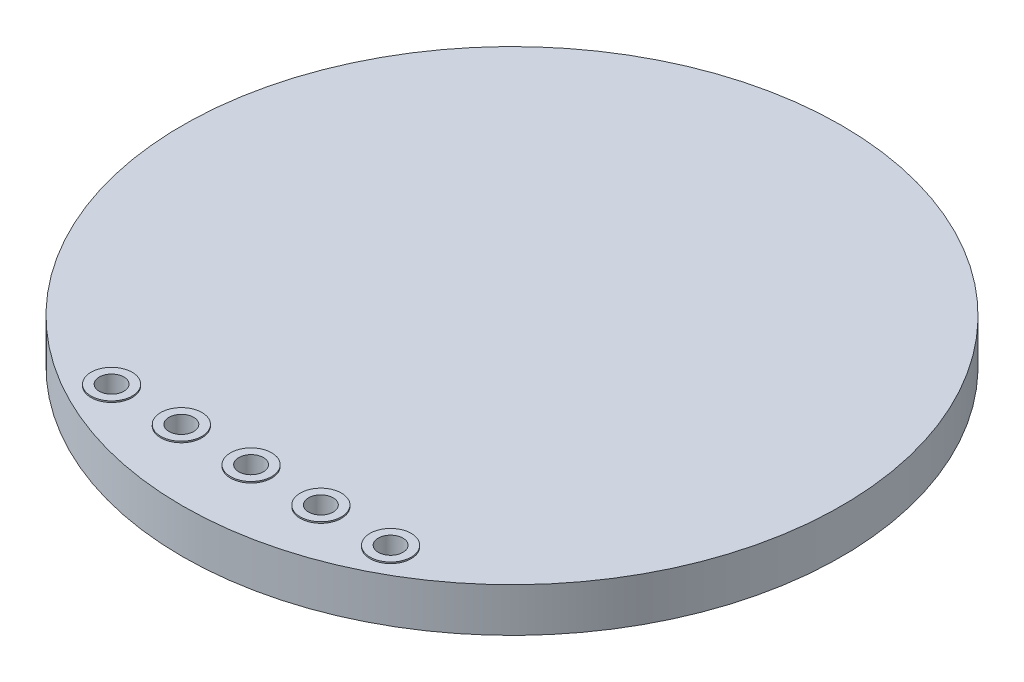
ISO-10303-21;
HEADER;
FILE_DESCRIPTION(('STEP AP214'),'2;1');
FILE_NAME('part.step','',(''),(''),'','','');
FILE_SCHEMA(('AUTOMOTIVE_DESIGN { 1 0 10303 214 1 1 1 1 }'));
ENDSEC;
DATA;
#1=APPLICATION_CONTEXT('core data for automotive mechanical design processes');
#2=APPLICATION_PROTOCOL_DEFINITION('international standard','automotive_design',2000,#1);
#3=PRODUCT_CONTEXT('',#1,'mechanical');
#4=PRODUCT('Part','Part','',(#3));
#5=PRODUCT_RELATED_PRODUCT_CATEGORY('part','',(#4));
#6=PRODUCT_DEFINITION_FORMATION('','',#4);
#7=PRODUCT_DEFINITION_CONTEXT('part definition',#1,'design');
#8=PRODUCT_DEFINITION('design','',#6,#7);
#9=PRODUCT_DEFINITION_SHAPE('','',#8);
#10=(LENGTH_UNIT() NAMED_UNIT(*) SI_UNIT(.MILLI.,.METRE.));
#11=(NAMED_UNIT(*) PLANE_ANGLE_UNIT() SI_UNIT($,.RADIAN.));
#12=(NAMED_UNIT(*) SI_UNIT($,.STERADIAN.) SOLID_ANGLE_UNIT());
#13=UNCERTAINTY_MEASURE_WITH_UNIT(LENGTH_MEASURE(1.E-05),#10,'distance_accuracy_value','');
#14=(GEOMETRIC_REPRESENTATION_CONTEXT(3) GLOBAL_UNCERTAINTY_ASSIGNED_CONTEXT((#13)) GLOBAL_UNIT_ASSIGNED_CONTEXT((#10,
#11,#12)) REPRESENTATION_CONTEXT('',''));
#15=CARTESIAN_POINT('',(0.,0.,0.));
#16=DIRECTION('',(0.,0.,1.));
#17=DIRECTION('',(1.,0.,0.));
#18=AXIS2_PLACEMENT_3D('',#15,#16,#17);
#19=CARTESIAN_POINT('',(0.,0.8,0.));
#20=DIRECTION('',(0.,1.,0.));
#21=DIRECTION('',(0.,0.,1.));
#22=AXIS2_PLACEMENT_3D('',#19,#20,#21);
#23=PLANE('',#22);
#24=CARTESIAN_POINT('',(2.54,0.8,9.5));
#25=DIRECTION('',(0.,1.,0.));
#26=DIRECTION('',(0.,0.,1.));
#27=AXIS2_PLACEMENT_3D('',#24,#25,#26);
#28=CIRCLE('',#27,0.750000000000001);
#29=CARTESIAN_POINT('',(2.54,0.8,10.25));
#30=VERTEX_POINT('',#29);
#31=EDGE_CURVE('E79',#30,#30,#28,.F.);
#32=ORIENTED_EDGE('',*,*,#31,.T.);
#33=EDGE_LOOP('',(#32));
#34=FACE_BOUND('',#33,.T.);
#35=CARTESIAN_POINT('',(-2.54,0.8,9.50000000000002));
#36=DIRECTION('',(0.,1.,0.));
#37=DIRECTION('',(0.,0.,1.));
#38=AXIS2_PLACEMENT_3D('',#35,#36,#37);
#39=CIRCLE('',#38,0.750000000000001);
#40=CARTESIAN_POINT('',(-2.54,0.8,10.25));
#41=VERTEX_POINT('',#40);
#42=EDGE_CURVE('E67',#41,#41,#39,.F.);
#43=ORIENTED_EDGE('',*,*,#42,.T.);
#44=EDGE_LOOP('',(#43));
#45=FACE_BOUND('',#44,.T.);
#46=CARTESIAN_POINT('',(0.,0.8,0.));
#47=DIRECTION('',(0.,1.,0.));
#48=DIRECTION('',(0.,0.,1.));
#49=AXIS2_PLACEMENT_3D('',#46,#47,#48);
#50=CIRCLE('',#49,12.);
#51=CARTESIAN_POINT('',(0.,0.8,12.));
#52=VERTEX_POINT('',#51);
#53=EDGE_CURVE('E10',#52,#52,#50,.T.);
#54=ORIENTED_EDGE('',*,*,#53,.T.);
#55=EDGE_LOOP('',(#54));
#56=FACE_BOUND('',#55,.T.);
#57=CARTESIAN_POINT('',(-5.08,0.8,9.50000000000003));
#58=DIRECTION('',(0.,1.,0.));
#59=DIRECTION('',(0.,0.,1.));
#60=AXIS2_PLACEMENT_3D('',#57,#58,#59);
#61=CIRCLE('',#60,0.750000000000003);
#62=CARTESIAN_POINT('',(-5.08,0.8,10.25));
#63=VERTEX_POINT('',#62);
#64=EDGE_CURVE('E58',#63,#63,#61,.F.);
#65=ORIENTED_EDGE('',*,*,#64,.T.);
#66=EDGE_LOOP('',(#65));
#67=FACE_BOUND('',#66,.T.);
#68=CARTESIAN_POINT('',(0.,0.8,9.5));
#69=DIRECTION('',(0.,1.,0.));
#70=DIRECTION('',(0.,0.,1.));
#71=AXIS2_PLACEMENT_3D('',#68,#69,#70);
#72=CIRCLE('',#71,0.750000000000001);
#73=CARTESIAN_POINT('',(0.,0.8,10.25));
#74=VERTEX_POINT('',#73);
#75=EDGE_CURVE('E73',#74,#74,#72,.F.);
#76=ORIENTED_EDGE('',*,*,#75,.T.);
#77=EDGE_LOOP('',(#76));
#78=FACE_BOUND('',#77,.T.);
#79=CARTESIAN_POINT('',(5.08,0.8,9.5));
#80=DIRECTION('',(0.,1.,0.));
#81=DIRECTION('',(0.,0.,1.));
#82=AXIS2_PLACEMENT_3D('',#79,#80,#81);
#83=CIRCLE('',#82,0.750000000000003);
#84=CARTESIAN_POINT('',(5.08,0.8,10.25));
#85=VERTEX_POINT('',#84);
#86=EDGE_CURVE('E85',#85,#85,#83,.F.);
#87=ORIENTED_EDGE('',*,*,#86,.T.);
#88=EDGE_LOOP('',(#87));
#89=FACE_BOUND('',#88,.T.);
#90=ADVANCED_FACE('F43',(#34,#45,#56,#67,#78,#89),#23,.T.);
#91=CARTESIAN_POINT('',(0.,0.8,0.));
#92=DIRECTION('',(0.,-1.,0.));
#93=DIRECTION('',(0.,0.,-1.));
#94=AXIS2_PLACEMENT_3D('',#91,#92,#93);
#95=CYLINDRICAL_SURFACE('',#94,12.);
#96=ORIENTED_EDGE('',*,*,#53,.F.);
#97=EDGE_LOOP('',(#96));
#98=FACE_BOUND('',#97,.T.);
#99=CARTESIAN_POINT('',(0.,-0.8,0.));
#100=DIRECTION('',(0.,1.,0.));
#101=DIRECTION('',(0.,0.,1.));
#102=AXIS2_PLACEMENT_3D('',#99,#100,#101);
#103=CIRCLE('',#102,12.);
#104=CARTESIAN_POINT('',(0.,-0.8,12.));
#105=VERTEX_POINT('',#104);
#106=EDGE_CURVE('E52',#105,#105,#103,.T.);
#107=ORIENTED_EDGE('',*,*,#106,.T.);
#108=EDGE_LOOP('',(#107));
#109=FACE_BOUND('',#108,.T.);
#110=ADVANCED_FACE('F45',(#98,#109),#95,.T.);
#111=CARTESIAN_POINT('',(0.,-0.8,0.));
#112=DIRECTION('',(0.,1.,0.));
#113=DIRECTION('',(0.,0.,1.));
#114=AXIS2_PLACEMENT_3D('',#111,#112,#113);
#115=PLANE('',#114);
#116=CARTESIAN_POINT('',(5.08,-0.8,9.5));
#117=DIRECTION('',(0.,1.,0.));
#118=DIRECTION('',(0.,0.,1.));
#119=AXIS2_PLACEMENT_3D('',#116,#117,#118);
#120=CIRCLE('',#119,0.750000000000003);
#121=CARTESIAN_POINT('',(5.08,-0.8,10.25));
#122=VERTEX_POINT('',#121);
#123=EDGE_CURVE('E47',#122,#122,#120,.T.);
#124=ORIENTED_EDGE('',*,*,#123,.T.);
#125=EDGE_LOOP('',(#124));
#126=FACE_BOUND('',#125,.T.);
#127=CARTESIAN_POINT('',(2.54,-0.8,9.5));
#128=DIRECTION('',(0.,1.,0.));
#129=DIRECTION('',(0.,0.,1.));
#130=AXIS2_PLACEMENT_3D('',#127,#128,#129);
#131=CIRCLE('',#130,0.750000000000001);
#132=CARTESIAN_POINT('',(2.54,-0.8,10.25));
#133=VERTEX_POINT('',#132);
#134=EDGE_CURVE('E108',#133,#133,#131,.T.);
#135=ORIENTED_EDGE('',*,*,#134,.T.);
#136=EDGE_LOOP('',(#135));
#137=FACE_BOUND('',#136,.T.);
#138=CARTESIAN_POINT('',(0.,-0.8,9.5));
#139=DIRECTION('',(0.,1.,0.));
#140=DIRECTION('',(0.,0.,1.));
#141=AXIS2_PLACEMENT_3D('',#138,#139,#140);
#142=CIRCLE('',#141,0.750000000000001);
#143=CARTESIAN_POINT('',(0.,-0.8,10.25));
#144=VERTEX_POINT('',#143);
#145=EDGE_CURVE('E103',#144,#144,#142,.T.);
#146=ORIENTED_EDGE('',*,*,#145,.T.);
#147=EDGE_LOOP('',(#146));
#148=FACE_BOUND('',#147,.T.);
#149=CARTESIAN_POINT('',(-2.54,-0.8,9.50000000000002));
#150=DIRECTION('',(0.,1.,0.));
#151=DIRECTION('',(0.,0.,1.));
#152=AXIS2_PLACEMENT_3D('',#149,#150,#151);
#153=CIRCLE('',#152,0.750000000000001);
#154=CARTESIAN_POINT('',(-2.54,-0.8,10.25));
#155=VERTEX_POINT('',#154);
#156=EDGE_CURVE('E97',#155,#155,#153,.T.);
#157=ORIENTED_EDGE('',*,*,#156,.T.);
#158=EDGE_LOOP('',(#157));
#159=FACE_BOUND('',#158,.T.);
#160=CARTESIAN_POINT('',(-5.08,-0.8,9.50000000000003));
#161=DIRECTION('',(0.,1.,0.));
#162=DIRECTION('',(0.,0.,1.));
#163=AXIS2_PLACEMENT_3D('',#160,#161,#162);
#164=CIRCLE('',#163,0.750000000000003);
#165=CARTESIAN_POINT('',(-5.08,-0.8,10.25));
#166=VERTEX_POINT('',#165);
#167=EDGE_CURVE('E91',#166,#166,#164,.T.);
#168=ORIENTED_EDGE('',*,*,#167,.T.);
#169=EDGE_LOOP('',(#168));
#170=FACE_BOUND('',#169,.T.);
#171=ORIENTED_EDGE('',*,*,#106,.F.);
#172=EDGE_LOOP('',(#171));
#173=FACE_BOUND('',#172,.T.);
#174=ADVANCED_FACE('F200',(#126,#137,#148,#159,#170,#173),#115,.F.);
#175=CARTESIAN_POINT('',(0.,-0.8,9.5));
#176=DIRECTION('',(0.,1.,0.));
#177=DIRECTION('',(0.,0.,1.));
#178=AXIS2_PLACEMENT_3D('',#175,#176,#177);
#179=CYLINDRICAL_SURFACE('',#178,0.450000000000001);
#180=CARTESIAN_POINT('',(0.,0.85,9.5));
#181=DIRECTION('',(0.,1.,0.));
#182=DIRECTION('',(0.,0.,1.));
#183=AXIS2_PLACEMENT_3D('',#180,#181,#182);
#184=CIRCLE('',#183,0.450000000000001);
#185=CARTESIAN_POINT('',(0.,0.85,9.95));
#186=VERTEX_POINT('',#185);
#187=EDGE_CURVE('E78',#186,#186,#184,.T.);
#188=ORIENTED_EDGE('',*,*,#187,.T.);
#189=EDGE_LOOP('',(#188));
#190=FACE_BOUND('',#189,.T.);
#191=CARTESIAN_POINT('',(0.,-0.85,9.5));
#192=DIRECTION('',(0.,1.,0.));
#193=DIRECTION('',(0.,0.,1.));
#194=AXIS2_PLACEMENT_3D('',#191,#192,#193);
#195=CIRCLE('',#194,0.450000000000001);
#196=CARTESIAN_POINT('',(0.,-0.85,9.95));
#197=VERTEX_POINT('',#196);
#198=EDGE_CURVE('E111',#197,#197,#195,.T.);
#199=ORIENTED_EDGE('',*,*,#198,.F.);
#200=EDGE_LOOP('',(#199));
#201=FACE_BOUND('',#200,.T.);
#202=ADVANCED_FACE('F204',(#190,#201),#179,.F.);
#203=CARTESIAN_POINT('',(2.54,-0.8,9.5));
#204=DIRECTION('',(0.,1.,0.));
#205=DIRECTION('',(0.,0.,1.));
#206=AXIS2_PLACEMENT_3D('',#203,#204,#205);
#207=CYLINDRICAL_SURFACE('',#206,0.45);
#208=CARTESIAN_POINT('',(2.54,0.85,9.5));
#209=DIRECTION('',(0.,1.,0.));
#210=DIRECTION('',(0.,0.,1.));
#211=AXIS2_PLACEMENT_3D('',#208,#209,#210);
#212=CIRCLE('',#211,0.450000000000001);
#213=CARTESIAN_POINT('',(2.54,0.85,9.95));
#214=VERTEX_POINT('',#213);
#215=EDGE_CURVE('E84',#214,#214,#212,.T.);
#216=ORIENTED_EDGE('',*,*,#215,.T.);
#217=EDGE_LOOP('',(#216));
#218=FACE_BOUND('',#217,.T.);
#219=CARTESIAN_POINT('',(2.54,-0.85,9.5));
#220=DIRECTION('',(0.,1.,0.));
#221=DIRECTION('',(0.,0.,1.));
#222=AXIS2_PLACEMENT_3D('',#219,#220,#221);
#223=CIRCLE('',#222,0.450000000000001);
#224=CARTESIAN_POINT('',(2.54,-0.85,9.95));
#225=VERTEX_POINT('',#224);
#226=EDGE_CURVE('E120',#225,#225,#223,.T.);
#227=ORIENTED_EDGE('',*,*,#226,.F.);
#228=EDGE_LOOP('',(#227));
#229=FACE_BOUND('',#228,.T.);
#230=ADVANCED_FACE('F211',(#218,#229),#207,.F.);
#231=CARTESIAN_POINT('',(5.08,-0.8,9.5));
#232=DIRECTION('',(0.,1.,0.));
#233=DIRECTION('',(0.,0.,1.));
#234=AXIS2_PLACEMENT_3D('',#231,#232,#233);
#235=CYLINDRICAL_SURFACE('',#234,0.450000000000002);
#236=CARTESIAN_POINT('',(5.08,0.85,9.5));
#237=DIRECTION('',(0.,1.,0.));
#238=DIRECTION('',(0.,0.,1.));
#239=AXIS2_PLACEMENT_3D('',#236,#237,#238);
#240=CIRCLE('',#239,0.450000000000003);
#241=CARTESIAN_POINT('',(5.08,0.85,9.95));
#242=VERTEX_POINT('',#241);
#243=EDGE_CURVE('E90',#242,#242,#240,.T.);
#244=ORIENTED_EDGE('',*,*,#243,.T.);
#245=EDGE_LOOP('',(#244));
#246=FACE_BOUND('',#245,.T.);
#247=CARTESIAN_POINT('',(5.08,-0.85,9.5));
#248=DIRECTION('',(0.,1.,0.));
#249=DIRECTION('',(0.,0.,1.));
#250=AXIS2_PLACEMENT_3D('',#247,#248,#249);
#251=CIRCLE('',#250,0.450000000000003);
#252=CARTESIAN_POINT('',(5.08,-0.85,9.95));
#253=VERTEX_POINT('',#252);
#254=EDGE_CURVE('E317',#253,#253,#251,.T.);
#255=ORIENTED_EDGE('',*,*,#254,.F.);
#256=EDGE_LOOP('',(#255));
#257=FACE_BOUND('',#256,.T.);
#258=ADVANCED_FACE('F275',(#246,#257),#235,.F.);
#259=CARTESIAN_POINT('',(-2.54,-0.8,9.50000000000002));
#260=DIRECTION('',(0.,1.,0.));
#261=DIRECTION('',(0.,0.,1.));
#262=AXIS2_PLACEMENT_3D('',#259,#260,#261);
#263=CYLINDRICAL_SURFACE('',#262,0.45);
#264=CARTESIAN_POINT('',(-2.54,0.85,9.50000000000002));
#265=DIRECTION('',(0.,1.,0.));
#266=DIRECTION('',(0.,0.,1.));
#267=AXIS2_PLACEMENT_3D('',#264,#265,#266);
#268=CIRCLE('',#267,0.450000000000001);
#269=CARTESIAN_POINT('',(-2.54,0.85,9.95000000000002));
#270=VERTEX_POINT('',#269);
#271=EDGE_CURVE('E72',#270,#270,#268,.T.);
#272=ORIENTED_EDGE('',*,*,#271,.T.);
#273=EDGE_LOOP('',(#272));
#274=FACE_BOUND('',#273,.T.);
#275=CARTESIAN_POINT('',(-2.54,-0.85,9.50000000000002));
#276=DIRECTION('',(0.,1.,0.));
#277=DIRECTION('',(0.,0.,1.));
#278=AXIS2_PLACEMENT_3D('',#275,#276,#277);
#279=CIRCLE('',#278,0.450000000000001);
#280=CARTESIAN_POINT('',(-2.54,-0.85,9.95000000000002));
#281=VERTEX_POINT('',#280);
#282=EDGE_CURVE('E106',#281,#281,#279,.T.);
#283=ORIENTED_EDGE('',*,*,#282,.F.);
#284=EDGE_LOOP('',(#283));
#285=FACE_BOUND('',#284,.T.);
#286=ADVANCED_FACE('F272',(#274,#285),#263,.F.);
#287=CARTESIAN_POINT('',(-5.08,-0.8,9.50000000000003));
#288=DIRECTION('',(0.,1.,0.));
#289=DIRECTION('',(0.,0.,1.));
#290=AXIS2_PLACEMENT_3D('',#287,#288,#289);
#291=CYLINDRICAL_SURFACE('',#290,0.450000000000002);
#292=CARTESIAN_POINT('',(-5.08,0.85,9.50000000000003));
#293=DIRECTION('',(0.,1.,0.));
#294=DIRECTION('',(0.,0.,1.));
#295=AXIS2_PLACEMENT_3D('',#292,#293,#294);
#296=CIRCLE('',#295,0.450000000000003);
#297=CARTESIAN_POINT('',(-5.08,0.85,9.95000000000004));
#298=VERTEX_POINT('',#297);
#299=EDGE_CURVE('E71',#298,#298,#296,.T.);
#300=ORIENTED_EDGE('',*,*,#299,.T.);
#301=EDGE_LOOP('',(#300));
#302=FACE_BOUND('',#301,.T.);
#303=CARTESIAN_POINT('',(-5.08,-0.85,9.50000000000003));
#304=DIRECTION('',(0.,1.,0.));
#305=DIRECTION('',(0.,0.,1.));
#306=AXIS2_PLACEMENT_3D('',#303,#304,#305);
#307=CIRCLE('',#306,0.450000000000003);
#308=CARTESIAN_POINT('',(-5.08,-0.85,9.95000000000004));
#309=VERTEX_POINT('',#308);
#310=EDGE_CURVE('E101',#309,#309,#307,.T.);
#311=ORIENTED_EDGE('',*,*,#310,.F.);
#312=EDGE_LOOP('',(#311));
#313=FACE_BOUND('',#312,.T.);
#314=ADVANCED_FACE('F190',(#302,#313),#291,.F.);
#315=CARTESIAN_POINT('',(-5.08,0.85,9.50000000000003));
#316=DIRECTION('',(0.,1.,0.));
#317=DIRECTION('',(0.,0.,1.));
#318=AXIS2_PLACEMENT_3D('',#315,#316,#317);
#319=PLANE('',#318);
#320=CARTESIAN_POINT('',(-5.08,0.85,9.50000000000003));
#321=DIRECTION('',(0.,1.,0.));
#322=DIRECTION('',(0.,0.,1.));
#323=AXIS2_PLACEMENT_3D('',#320,#321,#322);
#324=CIRCLE('',#323,0.750000000000003);
#325=CARTESIAN_POINT('',(-5.08,0.85,10.25));
#326=VERTEX_POINT('',#325);
#327=EDGE_CURVE('E61',#326,#326,#324,.T.);
#328=ORIENTED_EDGE('',*,*,#327,.T.);
#329=EDGE_LOOP('',(#328));
#330=FACE_BOUND('',#329,.T.);
#331=ORIENTED_EDGE('',*,*,#299,.F.);
#332=EDGE_LOOP('',(#331));
#333=FACE_BOUND('',#332,.T.);
#334=ADVANCED_FACE('F175',(#330,#333),#319,.T.);
#335=CARTESIAN_POINT('',(-5.08,0.85,9.50000000000003));
#336=DIRECTION('',(0.,-1.,0.));
#337=DIRECTION('',(0.,0.,-1.));
#338=AXIS2_PLACEMENT_3D('',#335,#336,#337);
#339=CYLINDRICAL_SURFACE('',#338,0.750000000000003);
#340=ORIENTED_EDGE('',*,*,#64,.F.);
#341=EDGE_LOOP('',(#340));
#342=FACE_BOUND('',#341,.T.);
#343=ORIENTED_EDGE('',*,*,#327,.F.);
#344=EDGE_LOOP('',(#343));
#345=FACE_BOUND('',#344,.T.);
#346=ADVANCED_FACE('F178',(#342,#345),#339,.T.);
#347=CARTESIAN_POINT('',(-2.54,0.85,9.50000000000002));
#348=DIRECTION('',(0.,1.,0.));
#349=DIRECTION('',(0.,0.,1.));
#350=AXIS2_PLACEMENT_3D('',#347,#348,#349);
#351=PLANE('',#350);
#352=CARTESIAN_POINT('',(-2.54,0.85,9.50000000000002));
#353=DIRECTION('',(0.,1.,0.));
#354=DIRECTION('',(0.,0.,1.));
#355=AXIS2_PLACEMENT_3D('',#352,#353,#354);
#356=CIRCLE('',#355,0.750000000000001);
#357=CARTESIAN_POINT('',(-2.54,0.85,10.25));
#358=VERTEX_POINT('',#357);
#359=EDGE_CURVE('E77',#358,#358,#356,.T.);
#360=ORIENTED_EDGE('',*,*,#359,.T.);
#361=EDGE_LOOP('',(#360));
#362=FACE_BOUND('',#361,.T.);
#363=ORIENTED_EDGE('',*,*,#271,.F.);
#364=EDGE_LOOP('',(#363));
#365=FACE_BOUND('',#364,.T.);
#366=ADVANCED_FACE('F180',(#362,#365),#351,.T.);
#367=CARTESIAN_POINT('',(-2.54,0.85,9.50000000000002));
#368=DIRECTION('',(0.,-1.,0.));
#369=DIRECTION('',(0.,0.,-1.));
#370=AXIS2_PLACEMENT_3D('',#367,#368,#369);
#371=CYLINDRICAL_SURFACE('',#370,0.750000000000001);
#372=ORIENTED_EDGE('',*,*,#42,.F.);
#373=EDGE_LOOP('',(#372));
#374=FACE_BOUND('',#373,.T.);
#375=ORIENTED_EDGE('',*,*,#359,.F.);
#376=EDGE_LOOP('',(#375));
#377=FACE_BOUND('',#376,.T.);
#378=ADVANCED_FACE('F187',(#374,#377),#371,.T.);
#379=CARTESIAN_POINT('',(0.,0.85,9.5));
#380=DIRECTION('',(0.,1.,0.));
#381=DIRECTION('',(0.,0.,1.));
#382=AXIS2_PLACEMENT_3D('',#379,#380,#381);
#383=PLANE('',#382);
#384=CARTESIAN_POINT('',(0.,0.85,9.5));
#385=DIRECTION('',(0.,1.,0.));
#386=DIRECTION('',(0.,0.,1.));
#387=AXIS2_PLACEMENT_3D('',#384,#385,#386);
#388=CIRCLE('',#387,0.750000000000001);
#389=CARTESIAN_POINT('',(0.,0.85,10.25));
#390=VERTEX_POINT('',#389);
#391=EDGE_CURVE('E83',#390,#390,#388,.T.);
#392=ORIENTED_EDGE('',*,*,#391,.T.);
#393=EDGE_LOOP('',(#392));
#394=FACE_BOUND('',#393,.T.);
#395=ORIENTED_EDGE('',*,*,#187,.F.);
#396=EDGE_LOOP('',(#395));
#397=FACE_BOUND('',#396,.T.);
#398=ADVANCED_FACE('F257',(#394,#397),#383,.T.);
#399=CARTESIAN_POINT('',(0.,0.85,9.5));
#400=DIRECTION('',(0.,-1.,0.));
#401=DIRECTION('',(0.,0.,-1.));
#402=AXIS2_PLACEMENT_3D('',#399,#400,#401);
#403=CYLINDRICAL_SURFACE('',#402,0.750000000000001);
#404=ORIENTED_EDGE('',*,*,#75,.F.);
#405=EDGE_LOOP('',(#404));
#406=FACE_BOUND('',#405,.T.);
#407=ORIENTED_EDGE('',*,*,#391,.F.);
#408=EDGE_LOOP('',(#407));
#409=FACE_BOUND('',#408,.T.);
#410=ADVANCED_FACE('F253',(#406,#409),#403,.T.);
#411=CARTESIAN_POINT('',(2.54,0.85,9.5));
#412=DIRECTION('',(0.,1.,0.));
#413=DIRECTION('',(0.,0.,1.));
#414=AXIS2_PLACEMENT_3D('',#411,#412,#413);
#415=PLANE('',#414);
#416=CARTESIAN_POINT('',(2.54,0.85,9.5));
#417=DIRECTION('',(0.,1.,0.));
#418=DIRECTION('',(0.,0.,1.));
#419=AXIS2_PLACEMENT_3D('',#416,#417,#418);
#420=CIRCLE('',#419,0.750000000000001);
#421=CARTESIAN_POINT('',(2.54,0.85,10.25));
#422=VERTEX_POINT('',#421);
#423=EDGE_CURVE('E89',#422,#422,#420,.T.);
#424=ORIENTED_EDGE('',*,*,#423,.T.);
#425=EDGE_LOOP('',(#424));
#426=FACE_BOUND('',#425,.T.);
#427=ORIENTED_EDGE('',*,*,#215,.F.);
#428=EDGE_LOOP('',(#427));
#429=FACE_BOUND('',#428,.T.);
#430=ADVANCED_FACE('F249',(#426,#429),#415,.T.);
#431=CARTESIAN_POINT('',(2.54,0.85,9.5));
#432=DIRECTION('',(0.,-1.,0.));
#433=DIRECTION('',(0.,0.,-1.));
#434=AXIS2_PLACEMENT_3D('',#431,#432,#433);
#435=CYLINDRICAL_SURFACE('',#434,0.750000000000001);
#436=ORIENTED_EDGE('',*,*,#31,.F.);
#437=EDGE_LOOP('',(#436));
#438=FACE_BOUND('',#437,.T.);
#439=ORIENTED_EDGE('',*,*,#423,.F.);
#440=EDGE_LOOP('',(#439));
#441=FACE_BOUND('',#440,.T.);
#442=ADVANCED_FACE('F245',(#438,#441),#435,.T.);
#443=CARTESIAN_POINT('',(5.08,0.85,9.5));
#444=DIRECTION('',(0.,1.,0.));
#445=DIRECTION('',(0.,0.,1.));
#446=AXIS2_PLACEMENT_3D('',#443,#444,#445);
#447=PLANE('',#446);
#448=CARTESIAN_POINT('',(5.08,0.85,9.5));
#449=DIRECTION('',(0.,1.,0.));
#450=DIRECTION('',(0.,0.,1.));
#451=AXIS2_PLACEMENT_3D('',#448,#449,#450);
#452=CIRCLE('',#451,0.750000000000003);
#453=CARTESIAN_POINT('',(5.08,0.85,10.25));
#454=VERTEX_POINT('',#453);
#455=EDGE_CURVE('E95',#454,#454,#452,.T.);
#456=ORIENTED_EDGE('',*,*,#455,.T.);
#457=EDGE_LOOP('',(#456));
#458=FACE_BOUND('',#457,.T.);
#459=ORIENTED_EDGE('',*,*,#243,.F.);
#460=EDGE_LOOP('',(#459));
#461=FACE_BOUND('',#460,.T.);
#462=ADVANCED_FACE('F238',(#458,#461),#447,.T.);
#463=CARTESIAN_POINT('',(5.08,0.85,9.5));
#464=DIRECTION('',(0.,-1.,0.));
#465=DIRECTION('',(0.,0.,-1.));
#466=AXIS2_PLACEMENT_3D('',#463,#464,#465);
#467=CYLINDRICAL_SURFACE('',#466,0.750000000000003);
#468=ORIENTED_EDGE('',*,*,#86,.F.);
#469=EDGE_LOOP('',(#468));
#470=FACE_BOUND('',#469,.T.);
#471=ORIENTED_EDGE('',*,*,#455,.F.);
#472=EDGE_LOOP('',(#471));
#473=FACE_BOUND('',#472,.T.);
#474=ADVANCED_FACE('F228',(#470,#473),#467,.T.);
#475=CARTESIAN_POINT('',(-5.08,-0.85,9.50000000000003));
#476=DIRECTION('',(0.,1.,0.));
#477=DIRECTION('',(0.,0.,1.));
#478=AXIS2_PLACEMENT_3D('',#475,#476,#477);
#479=CYLINDRICAL_SURFACE('',#478,0.750000000000003);
#480=CARTESIAN_POINT('',(-5.08,-0.85,9.50000000000003));
#481=DIRECTION('',(0.,1.,0.));
#482=DIRECTION('',(0.,0.,1.));
#483=AXIS2_PLACEMENT_3D('',#480,#481,#482);
#484=CIRCLE('',#483,0.750000000000003);
#485=CARTESIAN_POINT('',(-5.08,-0.85,10.25));
#486=VERTEX_POINT('',#485);
#487=EDGE_CURVE('E96',#486,#486,#484,.T.);
#488=ORIENTED_EDGE('',*,*,#487,.T.);
#489=EDGE_LOOP('',(#488));
#490=FACE_BOUND('',#489,.T.);
#491=ORIENTED_EDGE('',*,*,#167,.F.);
#492=EDGE_LOOP('',(#491));
#493=FACE_BOUND('',#492,.T.);
#494=ADVANCED_FACE('F225',(#490,#493),#479,.T.);
#495=CARTESIAN_POINT('',(-5.08,-0.85,9.50000000000003));
#496=DIRECTION('',(0.,-1.,0.));
#497=DIRECTION('',(0.,0.,1.));
#498=AXIS2_PLACEMENT_3D('',#495,#496,#497);
#499=PLANE('',#498);
#500=ORIENTED_EDGE('',*,*,#310,.T.);
#501=EDGE_LOOP('',(#500));
#502=FACE_BOUND('',#501,.T.);
#503=ORIENTED_EDGE('',*,*,#487,.F.);
#504=EDGE_LOOP('',(#503));
#505=FACE_BOUND('',#504,.T.);
#506=ADVANCED_FACE('F227',(#502,#505),#499,.T.);
#507=CARTESIAN_POINT('',(-2.54,-0.85,9.50000000000002));
#508=DIRECTION('',(0.,1.,0.));
#509=DIRECTION('',(0.,0.,1.));
#510=AXIS2_PLACEMENT_3D('',#507,#508,#509);
#511=CYLINDRICAL_SURFACE('',#510,0.750000000000001);
#512=CARTESIAN_POINT('',(-2.54,-0.85,9.50000000000002));
#513=DIRECTION('',(0.,1.,0.));
#514=DIRECTION('',(0.,0.,1.));
#515=AXIS2_PLACEMENT_3D('',#512,#513,#514);
#516=CIRCLE('',#515,0.750000000000001);
#517=CARTESIAN_POINT('',(-2.54,-0.85,10.25));
#518=VERTEX_POINT('',#517);
#519=EDGE_CURVE('E102',#518,#518,#516,.T.);
#520=ORIENTED_EDGE('',*,*,#519,.T.);
#521=EDGE_LOOP('',(#520));
#522=FACE_BOUND('',#521,.T.);
#523=ORIENTED_EDGE('',*,*,#156,.F.);
#524=EDGE_LOOP('',(#523));
#525=FACE_BOUND('',#524,.T.);
#526=ADVANCED_FACE('F235',(#522,#525),#511,.T.);
#527=CARTESIAN_POINT('',(-2.54,-0.85,9.50000000000002));
#528=DIRECTION('',(0.,-1.,0.));
#529=DIRECTION('',(0.,0.,1.));
#530=AXIS2_PLACEMENT_3D('',#527,#528,#529);
#531=PLANE('',#530);
#532=ORIENTED_EDGE('',*,*,#282,.T.);
#533=EDGE_LOOP('',(#532));
#534=FACE_BOUND('',#533,.T.);
#535=ORIENTED_EDGE('',*,*,#519,.F.);
#536=EDGE_LOOP('',(#535));
#537=FACE_BOUND('',#536,.T.);
#538=ADVANCED_FACE('F279',(#534,#537),#531,.T.);
#539=CARTESIAN_POINT('',(0.,-0.85,9.5));
#540=DIRECTION('',(0.,1.,0.));
#541=DIRECTION('',(0.,0.,1.));
#542=AXIS2_PLACEMENT_3D('',#539,#540,#541);
#543=CYLINDRICAL_SURFACE('',#542,0.750000000000001);
#544=CARTESIAN_POINT('',(0.,-0.85,9.5));
#545=DIRECTION('',(0.,1.,0.));
#546=DIRECTION('',(0.,0.,1.));
#547=AXIS2_PLACEMENT_3D('',#544,#545,#546);
#548=CIRCLE('',#547,0.750000000000001);
#549=CARTESIAN_POINT('',(0.,-0.85,10.25));
#550=VERTEX_POINT('',#549);
#551=EDGE_CURVE('E107',#550,#550,#548,.T.);
#552=ORIENTED_EDGE('',*,*,#551,.T.);
#553=EDGE_LOOP('',(#552));
#554=FACE_BOUND('',#553,.T.);
#555=ORIENTED_EDGE('',*,*,#145,.F.);
#556=EDGE_LOOP('',(#555));
#557=FACE_BOUND('',#556,.T.);
#558=ADVANCED_FACE('F282',(#554,#557),#543,.T.);
#559=CARTESIAN_POINT('',(0.,-0.85,9.5));
#560=DIRECTION('',(0.,-1.,0.));
#561=DIRECTION('',(0.,0.,1.));
#562=AXIS2_PLACEMENT_3D('',#559,#560,#561);
#563=PLANE('',#562);
#564=ORIENTED_EDGE('',*,*,#198,.T.);
#565=EDGE_LOOP('',(#564));
#566=FACE_BOUND('',#565,.T.);
#567=ORIENTED_EDGE('',*,*,#551,.F.);
#568=EDGE_LOOP('',(#567));
#569=FACE_BOUND('',#568,.T.);
#570=ADVANCED_FACE('F293',(#566,#569),#563,.T.);
#571=CARTESIAN_POINT('',(2.54,-0.85,9.5));
#572=DIRECTION('',(0.,1.,0.));
#573=DIRECTION('',(0.,0.,1.));
#574=AXIS2_PLACEMENT_3D('',#571,#572,#573);
#575=CYLINDRICAL_SURFACE('',#574,0.750000000000001);
#576=CARTESIAN_POINT('',(2.54,-0.85,9.5));
#577=DIRECTION('',(0.,1.,0.));
#578=DIRECTION('',(0.,0.,1.));
#579=AXIS2_PLACEMENT_3D('',#576,#577,#578);
#580=CIRCLE('',#579,0.750000000000001);
#581=CARTESIAN_POINT('',(2.54,-0.85,10.25));
#582=VERTEX_POINT('',#581);
#583=EDGE_CURVE('E112',#582,#582,#580,.T.);
#584=ORIENTED_EDGE('',*,*,#583,.T.);
#585=EDGE_LOOP('',(#584));
#586=FACE_BOUND('',#585,.T.);
#587=ORIENTED_EDGE('',*,*,#134,.F.);
#588=EDGE_LOOP('',(#587));
#589=FACE_BOUND('',#588,.T.);
#590=ADVANCED_FACE('F297',(#586,#589),#575,.T.);
#591=CARTESIAN_POINT('',(2.54,-0.85,9.5));
#592=DIRECTION('',(0.,-1.,0.));
#593=DIRECTION('',(0.,0.,1.));
#594=AXIS2_PLACEMENT_3D('',#591,#592,#593);
#595=PLANE('',#594);
#596=ORIENTED_EDGE('',*,*,#226,.T.);
#597=EDGE_LOOP('',(#596));
#598=FACE_BOUND('',#597,.T.);
#599=ORIENTED_EDGE('',*,*,#583,.F.);
#600=EDGE_LOOP('',(#599));
#601=FACE_BOUND('',#600,.T.);
#602=ADVANCED_FACE('F301',(#598,#601),#595,.T.);
#603=CARTESIAN_POINT('',(5.08,-0.85,9.5));
#604=DIRECTION('',(0.,1.,0.));
#605=DIRECTION('',(0.,0.,1.));
#606=AXIS2_PLACEMENT_3D('',#603,#604,#605);
#607=CYLINDRICAL_SURFACE('',#606,0.750000000000003);
#608=CARTESIAN_POINT('',(5.08,-0.85,9.5));
#609=DIRECTION('',(0.,1.,0.));
#610=DIRECTION('',(0.,0.,1.));
#611=AXIS2_PLACEMENT_3D('',#608,#609,#610);
#612=CIRCLE('',#611,0.750000000000003);
#613=CARTESIAN_POINT('',(5.08,-0.85,10.25));
#614=VERTEX_POINT('',#613);
#615=EDGE_CURVE('E320',#614,#614,#612,.T.);
#616=ORIENTED_EDGE('',*,*,#615,.T.);
#617=EDGE_LOOP('',(#616));
#618=FACE_BOUND('',#617,.T.);
#619=ORIENTED_EDGE('',*,*,#123,.F.);
#620=EDGE_LOOP('',(#619));
#621=FACE_BOUND('',#620,.T.);
#622=ADVANCED_FACE('F304',(#618,#621),#607,.T.);
#623=CARTESIAN_POINT('',(5.08,-0.85,9.5));
#624=DIRECTION('',(0.,-1.,0.));
#625=DIRECTION('',(0.,0.,1.));
#626=AXIS2_PLACEMENT_3D('',#623,#624,#625);
#627=PLANE('',#626);
#628=ORIENTED_EDGE('',*,*,#254,.T.);
#629=EDGE_LOOP('',(#628));
#630=FACE_BOUND('',#629,.T.);
#631=ORIENTED_EDGE('',*,*,#615,.F.);
#632=EDGE_LOOP('',(#631));
#633=FACE_BOUND('',#632,.T.);
#634=ADVANCED_FACE('F308',(#630,#633),#627,.T.);
#635=CLOSED_SHELL('',(#90,#110,#174,#202,#230,#258,#286,#314,#334,#346,#366,#378,#398,#410,#430,
#442,#462,#474,#494,#506,#526,#538,#558,#570,#590,#602,#622,#634));
#636=MANIFOLD_SOLID_BREP('B2',#635);
#637=ADVANCED_BREP_SHAPE_REPRESENTATION('',(#18,#636),#14);
#638=SHAPE_DEFINITION_REPRESENTATION(#9,#637);
ENDSEC;
END-ISO-10303-21;
